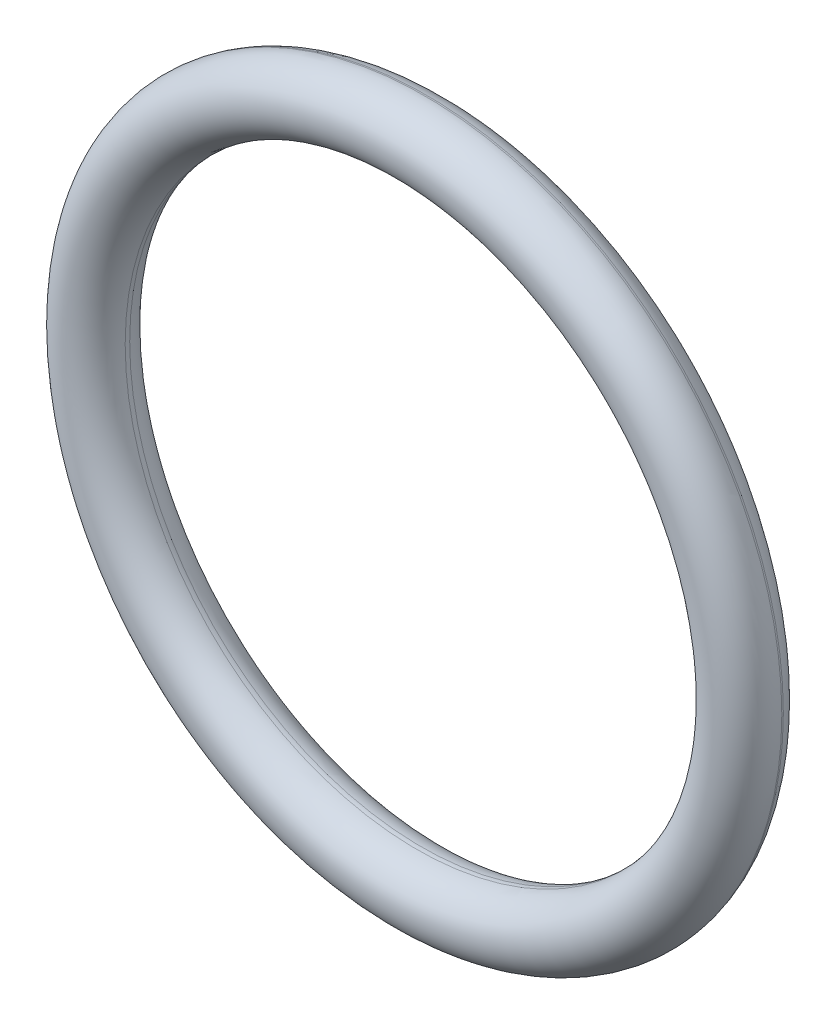
ISO-10303-21;
HEADER;
FILE_DESCRIPTION(('STEP AP214'),'2;1');
FILE_NAME('part.step','',(''),(''),'','','');
FILE_SCHEMA(('AUTOMOTIVE_DESIGN { 1 0 10303 214 1 1 1 1 }'));
ENDSEC;
DATA;
#1=APPLICATION_CONTEXT('core data for automotive mechanical design processes');
#2=APPLICATION_PROTOCOL_DEFINITION('international standard','automotive_design',2000,#1);
#3=PRODUCT_CONTEXT('',#1,'mechanical');
#4=PRODUCT('Part','Part','',(#3));
#5=PRODUCT_RELATED_PRODUCT_CATEGORY('part','',(#4));
#6=PRODUCT_DEFINITION_FORMATION('','',#4);
#7=PRODUCT_DEFINITION_CONTEXT('part definition',#1,'design');
#8=PRODUCT_DEFINITION('design','',#6,#7);
#9=PRODUCT_DEFINITION_SHAPE('','',#8);
#10=(LENGTH_UNIT() NAMED_UNIT(*) SI_UNIT(.MILLI.,.METRE.));
#11=(NAMED_UNIT(*) PLANE_ANGLE_UNIT() SI_UNIT($,.RADIAN.));
#12=(NAMED_UNIT(*) SI_UNIT($,.STERADIAN.) SOLID_ANGLE_UNIT());
#13=UNCERTAINTY_MEASURE_WITH_UNIT(LENGTH_MEASURE(1.E-05),#10,'distance_accuracy_value','');
#14=(GEOMETRIC_REPRESENTATION_CONTEXT(3) GLOBAL_UNCERTAINTY_ASSIGNED_CONTEXT((#13)) GLOBAL_UNIT_ASSIGNED_CONTEXT((#10,
#11,#12)) REPRESENTATION_CONTEXT('',''));
#15=CARTESIAN_POINT('',(0.,0.,0.));
#16=DIRECTION('',(0.,0.,1.));
#17=DIRECTION('',(1.,0.,0.));
#18=AXIS2_PLACEMENT_3D('',#15,#16,#17);
#19=CARTESIAN_POINT('',(0.,0.,0.0213744151835721));
#20=DIRECTION('',(0.,0.,-1.));
#21=DIRECTION('',(-1.,0.,0.));
#22=AXIS2_PLACEMENT_3D('',#19,#20,#21);
#23=TOROIDAL_SURFACE('',#22,5.85250752940665,0.552920822248067);
#24=CARTESIAN_POINT('',(0.,0.,-0.0426210639183355));
#25=DIRECTION('',(0.,0.,-1.));
#26=DIRECTION('',(-1.,0.,0.));
#27=AXIS2_PLACEMENT_3D('',#24,#25,#26);
#28=CIRCLE('',#27,5.303302636557);
#29=CARTESIAN_POINT('',(-5.303302636557,0.,-0.0426210639183355));
#30=VERTEX_POINT('',#29);
#31=EDGE_CURVE('E10',#30,#30,#28,.T.);
#32=ORIENTED_EDGE('',*,*,#31,.T.);
#33=EDGE_LOOP('',(#32));
#34=FACE_BOUND('',#33,.T.);
#35=CARTESIAN_POINT('',(0.,0.,0.0427488303671453));
#36=DIRECTION('',(0.,0.,-1.));
#37=DIRECTION('',(-1.,0.,0.));
#38=AXIS2_PLACEMENT_3D('',#35,#36,#37);
#39=CIRCLE('',#38,5.3);
#40=CARTESIAN_POINT('',(-5.3,0.,0.0427488303671453));
#41=VERTEX_POINT('',#40);
#42=EDGE_CURVE('E47',#41,#41,#39,.T.);
#43=ORIENTED_EDGE('',*,*,#42,.F.);
#44=EDGE_LOOP('',(#43));
#45=FACE_BOUND('',#44,.T.);
#46=ADVANCED_FACE('F33',(#34,#45),#23,.T.);
#47=CARTESIAN_POINT('',(0.,0.,0.0270778466120033));
#48=DIRECTION('',(0.,0.,-1.));
#49=DIRECTION('',(-1.,0.,0.));
#50=AXIS2_PLACEMENT_3D('',#47,#48,#49);
#51=TOROIDAL_SURFACE('',#50,5.90145399391453,0.602198459345234);
#52=CARTESIAN_POINT('',(0.,0.,-0.132476784804214));
#53=DIRECTION('',(0.,0.,-1.));
#54=DIRECTION('',(-1.,0.,0.));
#55=AXIS2_PLACEMENT_3D('',#52,#53,#54);
#56=CIRCLE('',#55,6.48213058551385);
#57=CARTESIAN_POINT('',(-6.48213058551385,0.,-0.132476784804214));
#58=VERTEX_POINT('',#57);
#59=EDGE_CURVE('E39',#58,#58,#56,.T.);
#60=ORIENTED_EDGE('',*,*,#59,.T.);
#61=EDGE_LOOP('',(#60));
#62=FACE_BOUND('',#61,.T.);
#63=ORIENTED_EDGE('',*,*,#31,.F.);
#64=EDGE_LOOP('',(#63));
#65=FACE_BOUND('',#64,.T.);
#66=ADVANCED_FACE('F57',(#62,#65),#51,.T.);
#67=CARTESIAN_POINT('',(0.,0.,0.));
#68=DIRECTION('',(0.,0.,-1.));
#69=DIRECTION('',(-1.,0.,0.));
#70=AXIS2_PLACEMENT_3D('',#67,#68,#69);
#71=TOROIDAL_SURFACE('',#70,6.,0.499999999999995);
#72=CARTESIAN_POINT('',(0.,0.,-0.0964134326156552));
#73=DIRECTION('',(0.,0.,-1.));
#74=DIRECTION('',(-1.,0.,0.));
#75=AXIS2_PLACEMENT_3D('',#72,#73,#74);
#76=CIRCLE('',#75,6.49061639802524);
#77=CARTESIAN_POINT('',(-6.49061639802524,0.,-0.0964134326156552));
#78=VERTEX_POINT('',#77);
#79=EDGE_CURVE('E43',#78,#78,#76,.T.);
#80=ORIENTED_EDGE('',*,*,#79,.T.);
#81=EDGE_LOOP('',(#80));
#82=FACE_BOUND('',#81,.T.);
#83=ORIENTED_EDGE('',*,*,#59,.F.);
#84=EDGE_LOOP('',(#83));
#85=FACE_BOUND('',#84,.T.);
#86=ADVANCED_FACE('F61',(#82,#85),#71,.T.);
#87=CARTESIAN_POINT('',(0.,0.,0.0195090763461678));
#88=DIRECTION('',(0.,0.,-1.));
#89=DIRECTION('',(-1.,0.,0.));
#90=AXIS2_PLACEMENT_3D('',#87,#88,#89);
#91=TOROIDAL_SURFACE('',#90,5.90072469669333,0.601174057477746);
#92=ORIENTED_EDGE('',*,*,#42,.T.);
#93=EDGE_LOOP('',(#92));
#94=FACE_BOUND('',#93,.T.);
#95=ORIENTED_EDGE('',*,*,#79,.F.);
#96=EDGE_LOOP('',(#95));
#97=FACE_BOUND('',#96,.T.);
#98=ADVANCED_FACE('F53',(#94,#97),#91,.T.);
#99=CLOSED_SHELL('',(#46,#66,#86,#98));
#100=MANIFOLD_SOLID_BREP('B2',#99);
#101=ADVANCED_BREP_SHAPE_REPRESENTATION('',(#18,#100),#14);
#102=SHAPE_DEFINITION_REPRESENTATION(#9,#101);
ENDSEC;
END-ISO-10303-21;
